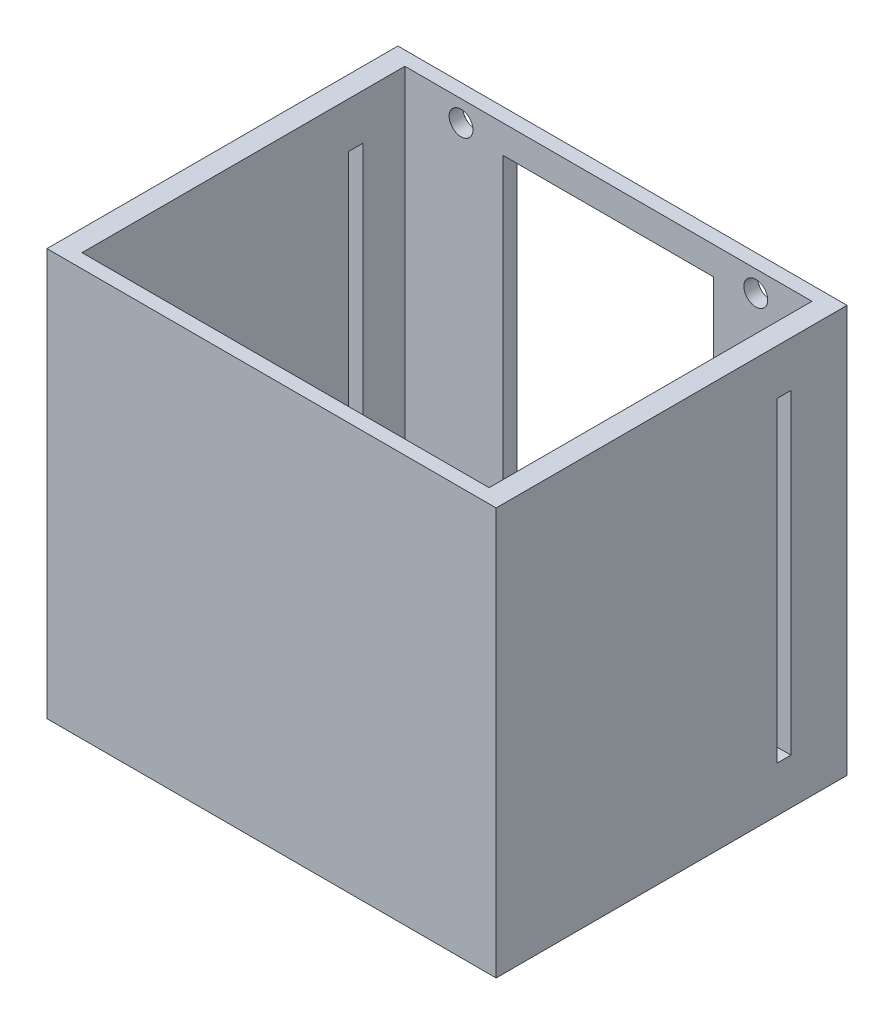
ISO-10303-21;
HEADER;
FILE_DESCRIPTION(('STEP AP214'),'2;1');
FILE_NAME('part.step','',(''),(''),'','','');
FILE_SCHEMA(('AUTOMOTIVE_DESIGN { 1 0 10303 214 1 1 1 1 }'));
ENDSEC;
DATA;
#1=APPLICATION_CONTEXT('core data for automotive mechanical design processes');
#2=APPLICATION_PROTOCOL_DEFINITION('international standard','automotive_design',2000,#1);
#3=PRODUCT_CONTEXT('',#1,'mechanical');
#4=PRODUCT('Part','Part','',(#3));
#5=PRODUCT_RELATED_PRODUCT_CATEGORY('part','',(#4));
#6=PRODUCT_DEFINITION_FORMATION('','',#4);
#7=PRODUCT_DEFINITION_CONTEXT('part definition',#1,'design');
#8=PRODUCT_DEFINITION('design','',#6,#7);
#9=PRODUCT_DEFINITION_SHAPE('','',#8);
#10=(LENGTH_UNIT() NAMED_UNIT(*) SI_UNIT(.MILLI.,.METRE.));
#11=(NAMED_UNIT(*) PLANE_ANGLE_UNIT() SI_UNIT($,.RADIAN.));
#12=(NAMED_UNIT(*) SI_UNIT($,.STERADIAN.) SOLID_ANGLE_UNIT());
#13=UNCERTAINTY_MEASURE_WITH_UNIT(LENGTH_MEASURE(1.E-05),#10,'distance_accuracy_value','');
#14=(GEOMETRIC_REPRESENTATION_CONTEXT(3) GLOBAL_UNCERTAINTY_ASSIGNED_CONTEXT((#13)) GLOBAL_UNIT_ASSIGNED_CONTEXT((#10,
#11,#12)) REPRESENTATION_CONTEXT('',''));
#15=CARTESIAN_POINT('',(0.,0.,0.));
#16=DIRECTION('',(0.,0.,1.));
#17=DIRECTION('',(1.,0.,0.));
#18=AXIS2_PLACEMENT_3D('',#15,#16,#17);
#19=CARTESIAN_POINT('',(-32.,58.,25.));
#20=DIRECTION('',(1.,0.,0.));
#21=DIRECTION('',(0.,0.,-1.));
#22=AXIS2_PLACEMENT_3D('',#19,#20,#21);
#23=PLANE('',#22);
#24=DIRECTION('',(0.,0.,-1.));
#25=VECTOR('',#24,1.);
#26=CARTESIAN_POINT('',(-32.,6.50000000000002,25.));
#27=LINE('',#26,#25);
#28=CARTESIAN_POINT('',(-32.,6.50000000000002,-15.));
#29=VERTEX_POINT('',#28);
#30=CARTESIAN_POINT('',(-32.,6.50000000000002,-17.));
#31=VERTEX_POINT('',#30);
#32=EDGE_CURVE('E255',#29,#31,#27,.T.);
#33=ORIENTED_EDGE('',*,*,#32,.T.);
#34=DIRECTION('',(0.,1.,0.));
#35=VECTOR('',#34,1.);
#36=CARTESIAN_POINT('',(-32.,58.,-17.));
#37=LINE('',#36,#35);
#38=CARTESIAN_POINT('',(-32.,51.5,-17.));
#39=VERTEX_POINT('',#38);
#40=EDGE_CURVE('E258',#31,#39,#37,.T.);
#41=ORIENTED_EDGE('',*,*,#40,.T.);
#42=DIRECTION('',(0.,0.,1.));
#43=VECTOR('',#42,1.);
#44=CARTESIAN_POINT('',(-32.,51.5,25.));
#45=LINE('',#44,#43);
#46=CARTESIAN_POINT('',(-32.,51.5,-15.));
#47=VERTEX_POINT('',#46);
#48=EDGE_CURVE('E243',#39,#47,#45,.T.);
#49=ORIENTED_EDGE('',*,*,#48,.T.);
#50=DIRECTION('',(0.,-1.,0.));
#51=VECTOR('',#50,1.);
#52=CARTESIAN_POINT('',(-32.,58.,-15.));
#53=LINE('',#52,#51);
#54=EDGE_CURVE('E252',#47,#29,#53,.T.);
#55=ORIENTED_EDGE('',*,*,#54,.T.);
#56=EDGE_LOOP('',(#33,#41,#49,#55));
#57=FACE_BOUND('',#56,.T.);
#58=DIRECTION('',(0.,0.,1.));
#59=VECTOR('',#58,1.);
#60=CARTESIAN_POINT('',(-32.,0.,25.));
#61=LINE('',#60,#59);
#62=CARTESIAN_POINT('',(-32.,0.,-25.));
#63=VERTEX_POINT('',#62);
#64=CARTESIAN_POINT('',(-32.,0.,25.));
#65=VERTEX_POINT('',#64);
#66=EDGE_CURVE('E319',#63,#65,#61,.T.);
#67=ORIENTED_EDGE('',*,*,#66,.T.);
#68=DIRECTION('',(0.,-1.,0.));
#69=VECTOR('',#68,1.);
#70=CARTESIAN_POINT('',(-32.,58.,25.));
#71=LINE('',#70,#69);
#72=CARTESIAN_POINT('',(-32.,58.,25.));
#73=VERTEX_POINT('',#72);
#74=EDGE_CURVE('E352',#73,#65,#71,.T.);
#75=ORIENTED_EDGE('',*,*,#74,.F.);
#76=DIRECTION('',(0.,0.,1.));
#77=VECTOR('',#76,1.);
#78=CARTESIAN_POINT('',(-32.,58.,25.));
#79=LINE('',#78,#77);
#80=CARTESIAN_POINT('',(-32.,58.,-25.));
#81=VERTEX_POINT('',#80);
#82=EDGE_CURVE('E326',#81,#73,#79,.T.);
#83=ORIENTED_EDGE('',*,*,#82,.F.);
#84=DIRECTION('',(0.,-1.,0.));
#85=VECTOR('',#84,1.);
#86=CARTESIAN_POINT('',(-32.,58.,-25.));
#87=LINE('',#86,#85);
#88=EDGE_CURVE('E336',#81,#63,#87,.T.);
#89=ORIENTED_EDGE('',*,*,#88,.T.);
#90=EDGE_LOOP('',(#67,#75,#83,#89));
#91=FACE_BOUND('',#90,.T.);
#92=ADVANCED_FACE('F37',(#57,#91),#23,.F.);
#93=CARTESIAN_POINT('',(32.,58.,25.));
#94=DIRECTION('',(0.,0.,-1.));
#95=DIRECTION('',(-1.,0.,0.));
#96=AXIS2_PLACEMENT_3D('',#93,#94,#95);
#97=PLANE('',#96);
#98=DIRECTION('',(1.,0.,0.));
#99=VECTOR('',#98,1.);
#100=CARTESIAN_POINT('',(32.,0.,25.));
#101=LINE('',#100,#99);
#102=CARTESIAN_POINT('',(32.,0.,25.));
#103=VERTEX_POINT('',#102);
#104=EDGE_CURVE('E339',#65,#103,#101,.T.);
#105=ORIENTED_EDGE('',*,*,#104,.T.);
#106=DIRECTION('',(0.,-1.,0.));
#107=VECTOR('',#106,1.);
#108=CARTESIAN_POINT('',(32.,58.,25.));
#109=LINE('',#108,#107);
#110=CARTESIAN_POINT('',(32.,58.,25.));
#111=VERTEX_POINT('',#110);
#112=EDGE_CURVE('E349',#111,#103,#109,.T.);
#113=ORIENTED_EDGE('',*,*,#112,.F.);
#114=DIRECTION('',(1.,0.,0.));
#115=VECTOR('',#114,1.);
#116=CARTESIAN_POINT('',(32.,58.,25.));
#117=LINE('',#116,#115);
#118=EDGE_CURVE('E329',#73,#111,#117,.T.);
#119=ORIENTED_EDGE('',*,*,#118,.F.);
#120=ORIENTED_EDGE('',*,*,#74,.T.);
#121=EDGE_LOOP('',(#105,#113,#119,#120));
#122=FACE_BOUND('',#121,.T.);
#123=ADVANCED_FACE('F386',(#122),#97,.F.);
#124=CARTESIAN_POINT('',(32.,58.,25.));
#125=DIRECTION('',(-1.,0.,0.));
#126=DIRECTION('',(0.,0.,1.));
#127=AXIS2_PLACEMENT_3D('',#124,#125,#126);
#128=PLANE('',#127);
#129=DIRECTION('',(0.,0.,-1.));
#130=VECTOR('',#129,1.);
#131=CARTESIAN_POINT('',(32.,51.5,25.));
#132=LINE('',#131,#130);
#133=CARTESIAN_POINT('',(32.,51.5,-15.));
#134=VERTEX_POINT('',#133);
#135=CARTESIAN_POINT('',(32.,51.5,-17.));
#136=VERTEX_POINT('',#135);
#137=EDGE_CURVE('E287',#134,#136,#132,.T.);
#138=ORIENTED_EDGE('',*,*,#137,.T.);
#139=DIRECTION('',(0.,-1.,0.));
#140=VECTOR('',#139,1.);
#141=CARTESIAN_POINT('',(32.,58.,-17.));
#142=LINE('',#141,#140);
#143=CARTESIAN_POINT('',(32.,6.5,-17.));
#144=VERTEX_POINT('',#143);
#145=EDGE_CURVE('E290',#136,#144,#142,.T.);
#146=ORIENTED_EDGE('',*,*,#145,.T.);
#147=DIRECTION('',(0.,0.,1.));
#148=VECTOR('',#147,1.);
#149=CARTESIAN_POINT('',(32.,6.5,25.));
#150=LINE('',#149,#148);
#151=CARTESIAN_POINT('',(32.,6.5,-15.));
#152=VERTEX_POINT('',#151);
#153=EDGE_CURVE('E275',#144,#152,#150,.T.);
#154=ORIENTED_EDGE('',*,*,#153,.T.);
#155=DIRECTION('',(0.,1.,0.));
#156=VECTOR('',#155,1.);
#157=CARTESIAN_POINT('',(32.,58.,-15.));
#158=LINE('',#157,#156);
#159=EDGE_CURVE('E284',#152,#134,#158,.T.);
#160=ORIENTED_EDGE('',*,*,#159,.T.);
#161=EDGE_LOOP('',(#138,#146,#154,#160));
#162=FACE_BOUND('',#161,.T.);
#163=DIRECTION('',(0.,0.,-1.));
#164=VECTOR('',#163,1.);
#165=CARTESIAN_POINT('',(32.,0.,25.));
#166=LINE('',#165,#164);
#167=CARTESIAN_POINT('',(32.,0.,-25.));
#168=VERTEX_POINT('',#167);
#169=EDGE_CURVE('E341',#103,#168,#166,.T.);
#170=ORIENTED_EDGE('',*,*,#169,.T.);
#171=DIRECTION('',(0.,-1.,0.));
#172=VECTOR('',#171,1.);
#173=CARTESIAN_POINT('',(32.,58.,-25.));
#174=LINE('',#173,#172);
#175=CARTESIAN_POINT('',(32.,58.,-25.));
#176=VERTEX_POINT('',#175);
#177=EDGE_CURVE('E346',#176,#168,#174,.T.);
#178=ORIENTED_EDGE('',*,*,#177,.F.);
#179=DIRECTION('',(0.,0.,-1.));
#180=VECTOR('',#179,1.);
#181=CARTESIAN_POINT('',(32.,58.,25.));
#182=LINE('',#181,#180);
#183=EDGE_CURVE('E332',#111,#176,#182,.T.);
#184=ORIENTED_EDGE('',*,*,#183,.F.);
#185=ORIENTED_EDGE('',*,*,#112,.T.);
#186=EDGE_LOOP('',(#170,#178,#184,#185));
#187=FACE_BOUND('',#186,.T.);
#188=ADVANCED_FACE('F391',(#162,#187),#128,.F.);
#189=CARTESIAN_POINT('',(32.,58.,-25.));
#190=DIRECTION('',(0.,0.,1.));
#191=DIRECTION('',(1.,0.,0.));
#192=AXIS2_PLACEMENT_3D('',#189,#190,#191);
#193=PLANE('',#192);
#194=DIRECTION('',(-1.,0.,0.));
#195=VECTOR('',#194,1.);
#196=CARTESIAN_POINT('',(-15.,4.,-25.));
#197=LINE('',#196,#195);
#198=CARTESIAN_POINT('',(15.,4.,-25.));
#199=VERTEX_POINT('',#198);
#200=CARTESIAN_POINT('',(-15.,4.,-25.));
#201=VERTEX_POINT('',#200);
#202=EDGE_CURVE('E185',#199,#201,#197,.T.);
#203=ORIENTED_EDGE('',*,*,#202,.F.);
#204=DIRECTION('',(0.,-1.,0.));
#205=VECTOR('',#204,1.);
#206=CARTESIAN_POINT('',(15.,4.,-25.));
#207=LINE('',#206,#205);
#208=CARTESIAN_POINT('',(15.,54.,-25.));
#209=VERTEX_POINT('',#208);
#210=EDGE_CURVE('E51',#209,#199,#207,.T.);
#211=ORIENTED_EDGE('',*,*,#210,.F.);
#212=DIRECTION('',(1.,0.,0.));
#213=VECTOR('',#212,1.);
#214=CARTESIAN_POINT('',(-15.,54.,-25.));
#215=LINE('',#214,#213);
#216=CARTESIAN_POINT('',(-15.,54.,-25.));
#217=VERTEX_POINT('',#216);
#218=EDGE_CURVE('E192',#217,#209,#215,.T.);
#219=ORIENTED_EDGE('',*,*,#218,.F.);
#220=DIRECTION('',(0.,1.,0.));
#221=VECTOR('',#220,1.);
#222=CARTESIAN_POINT('',(-15.,4.,-25.));
#223=LINE('',#222,#221);
#224=EDGE_CURVE('E176',#201,#217,#223,.T.);
#225=ORIENTED_EDGE('',*,*,#224,.F.);
#226=EDGE_LOOP('',(#203,#211,#219,#225));
#227=FACE_BOUND('',#226,.T.);
#228=CARTESIAN_POINT('',(21.,55.,-25.));
#229=DIRECTION('',(0.,0.,-1.));
#230=DIRECTION('',(-1.,0.,0.));
#231=AXIS2_PLACEMENT_3D('',#228,#229,#230);
#232=CIRCLE('',#231,1.725);
#233=CARTESIAN_POINT('',(19.275,55.,-25.));
#234=VERTEX_POINT('',#233);
#235=EDGE_CURVE('E199',#234,#234,#232,.T.);
#236=ORIENTED_EDGE('',*,*,#235,.F.);
#237=EDGE_LOOP('',(#236));
#238=FACE_BOUND('',#237,.T.);
#239=CARTESIAN_POINT('',(21.,3.,-25.));
#240=DIRECTION('',(0.,0.,-1.));
#241=DIRECTION('',(-1.,0.,0.));
#242=AXIS2_PLACEMENT_3D('',#239,#240,#241);
#243=CIRCLE('',#242,1.725);
#244=CARTESIAN_POINT('',(19.275,3.,-25.));
#245=VERTEX_POINT('',#244);
#246=EDGE_CURVE('E208',#245,#245,#243,.T.);
#247=ORIENTED_EDGE('',*,*,#246,.F.);
#248=EDGE_LOOP('',(#247));
#249=FACE_BOUND('',#248,.T.);
#250=CARTESIAN_POINT('',(-21.,3.,-25.));
#251=DIRECTION('',(0.,0.,-1.));
#252=DIRECTION('',(-1.,0.,0.));
#253=AXIS2_PLACEMENT_3D('',#250,#251,#252);
#254=CIRCLE('',#253,1.725);
#255=CARTESIAN_POINT('',(-22.725,3.,-25.));
#256=VERTEX_POINT('',#255);
#257=EDGE_CURVE('E215',#256,#256,#254,.T.);
#258=ORIENTED_EDGE('',*,*,#257,.F.);
#259=EDGE_LOOP('',(#258));
#260=FACE_BOUND('',#259,.T.);
#261=CARTESIAN_POINT('',(-21.,55.,-25.));
#262=DIRECTION('',(0.,0.,-1.));
#263=DIRECTION('',(-1.,0.,0.));
#264=AXIS2_PLACEMENT_3D('',#261,#262,#263);
#265=CIRCLE('',#264,1.725);
#266=CARTESIAN_POINT('',(-22.725,55.,-25.));
#267=VERTEX_POINT('',#266);
#268=EDGE_CURVE('E222',#267,#267,#265,.T.);
#269=ORIENTED_EDGE('',*,*,#268,.F.);
#270=EDGE_LOOP('',(#269));
#271=FACE_BOUND('',#270,.T.);
#272=DIRECTION('',(-1.,0.,0.));
#273=VECTOR('',#272,1.);
#274=CARTESIAN_POINT('',(32.,0.,-25.));
#275=LINE('',#274,#273);
#276=EDGE_CURVE('E330',#168,#63,#275,.T.);
#277=ORIENTED_EDGE('',*,*,#276,.T.);
#278=ORIENTED_EDGE('',*,*,#88,.F.);
#279=DIRECTION('',(-1.,0.,0.));
#280=VECTOR('',#279,1.);
#281=CARTESIAN_POINT('',(32.,58.,-25.));
#282=LINE('',#281,#280);
#283=EDGE_CURVE('E334',#176,#81,#282,.T.);
#284=ORIENTED_EDGE('',*,*,#283,.F.);
#285=ORIENTED_EDGE('',*,*,#177,.T.);
#286=EDGE_LOOP('',(#277,#278,#284,#285));
#287=FACE_BOUND('',#286,.T.);
#288=ADVANCED_FACE('F189',(#227,#238,#249,#260,#271,#287),#193,.F.);
#289=CARTESIAN_POINT('',(0.,58.,0.));
#290=DIRECTION('',(0.,1.,0.));
#291=DIRECTION('',(0.,0.,1.));
#292=AXIS2_PLACEMENT_3D('',#289,#290,#291);
#293=PLANE('',#292);
#294=DIRECTION('',(0.,0.,-1.));
#295=VECTOR('',#294,1.);
#296=CARTESIAN_POINT('',(-29.,58.,-23.));
#297=LINE('',#296,#295);
#298=CARTESIAN_POINT('',(-29.,58.,23.));
#299=VERTEX_POINT('',#298);
#300=CARTESIAN_POINT('',(-29.,58.,-23.));
#301=VERTEX_POINT('',#300);
#302=EDGE_CURVE('E294',#299,#301,#297,.T.);
#303=ORIENTED_EDGE('',*,*,#302,.T.);
#304=DIRECTION('',(1.,0.,0.));
#305=VECTOR('',#304,1.);
#306=CARTESIAN_POINT('',(29.,58.,-23.));
#307=LINE('',#306,#305);
#308=CARTESIAN_POINT('',(29.,58.,-23.));
#309=VERTEX_POINT('',#308);
#310=EDGE_CURVE('E297',#301,#309,#307,.T.);
#311=ORIENTED_EDGE('',*,*,#310,.T.);
#312=DIRECTION('',(0.,0.,1.));
#313=VECTOR('',#312,1.);
#314=CARTESIAN_POINT('',(29.,58.,-23.));
#315=LINE('',#314,#313);
#316=CARTESIAN_POINT('',(29.,58.,23.));
#317=VERTEX_POINT('',#316);
#318=EDGE_CURVE('E301',#309,#317,#315,.T.);
#319=ORIENTED_EDGE('',*,*,#318,.T.);
#320=DIRECTION('',(-1.,0.,0.));
#321=VECTOR('',#320,1.);
#322=CARTESIAN_POINT('',(29.,58.,23.));
#323=LINE('',#322,#321);
#324=EDGE_CURVE('E304',#317,#299,#323,.T.);
#325=ORIENTED_EDGE('',*,*,#324,.T.);
#326=EDGE_LOOP('',(#303,#311,#319,#325));
#327=FACE_BOUND('',#326,.T.);
#328=ORIENTED_EDGE('',*,*,#82,.T.);
#329=ORIENTED_EDGE('',*,*,#118,.T.);
#330=ORIENTED_EDGE('',*,*,#183,.T.);
#331=ORIENTED_EDGE('',*,*,#283,.T.);
#332=EDGE_LOOP('',(#328,#329,#330,#331));
#333=FACE_BOUND('',#332,.T.);
#334=ADVANCED_FACE('F405',(#327,#333),#293,.T.);
#335=CARTESIAN_POINT('',(0.,0.,0.));
#336=DIRECTION('',(0.,1.,0.));
#337=DIRECTION('',(0.,0.,1.));
#338=AXIS2_PLACEMENT_3D('',#335,#336,#337);
#339=PLANE('',#338);
#340=DIRECTION('',(1.,0.,0.));
#341=VECTOR('',#340,1.);
#342=CARTESIAN_POINT('',(29.,0.,-23.));
#343=LINE('',#342,#341);
#344=CARTESIAN_POINT('',(-29.,0.,-23.));
#345=VERTEX_POINT('',#344);
#346=CARTESIAN_POINT('',(29.,0.,-23.));
#347=VERTEX_POINT('',#346);
#348=EDGE_CURVE('E309',#345,#347,#343,.T.);
#349=ORIENTED_EDGE('',*,*,#348,.F.);
#350=DIRECTION('',(0.,0.,-1.));
#351=VECTOR('',#350,1.);
#352=CARTESIAN_POINT('',(-29.,0.,-23.));
#353=LINE('',#352,#351);
#354=CARTESIAN_POINT('',(-29.,0.,23.));
#355=VERTEX_POINT('',#354);
#356=EDGE_CURVE('E293',#355,#345,#353,.T.);
#357=ORIENTED_EDGE('',*,*,#356,.F.);
#358=DIRECTION('',(-1.,0.,0.));
#359=VECTOR('',#358,1.);
#360=CARTESIAN_POINT('',(29.,0.,23.));
#361=LINE('',#360,#359);
#362=CARTESIAN_POINT('',(29.,0.,23.));
#363=VERTEX_POINT('',#362);
#364=EDGE_CURVE('E298',#363,#355,#361,.T.);
#365=ORIENTED_EDGE('',*,*,#364,.F.);
#366=DIRECTION('',(0.,0.,1.));
#367=VECTOR('',#366,1.);
#368=CARTESIAN_POINT('',(29.,0.,-23.));
#369=LINE('',#368,#367);
#370=EDGE_CURVE('E312',#347,#363,#369,.T.);
#371=ORIENTED_EDGE('',*,*,#370,.F.);
#372=EDGE_LOOP('',(#349,#357,#365,#371));
#373=FACE_BOUND('',#372,.T.);
#374=ORIENTED_EDGE('',*,*,#66,.F.);
#375=ORIENTED_EDGE('',*,*,#276,.F.);
#376=ORIENTED_EDGE('',*,*,#169,.F.);
#377=ORIENTED_EDGE('',*,*,#104,.F.);
#378=EDGE_LOOP('',(#374,#375,#376,#377));
#379=FACE_BOUND('',#378,.T.);
#380=ADVANCED_FACE('F400',(#373,#379),#339,.F.);
#381=CARTESIAN_POINT('',(-29.,58.,-23.));
#382=DIRECTION('',(-1.,0.,0.));
#383=DIRECTION('',(0.,0.,1.));
#384=AXIS2_PLACEMENT_3D('',#381,#382,#383);
#385=PLANE('',#384);
#386=DIRECTION('',(0.,0.,1.));
#387=VECTOR('',#386,1.);
#388=CARTESIAN_POINT('',(-29.,51.5,-15.));
#389=LINE('',#388,#387);
#390=CARTESIAN_POINT('',(-29.,51.5,-17.));
#391=VERTEX_POINT('',#390);
#392=CARTESIAN_POINT('',(-29.,51.5,-15.));
#393=VERTEX_POINT('',#392);
#394=EDGE_CURVE('E231',#391,#393,#389,.T.);
#395=ORIENTED_EDGE('',*,*,#394,.F.);
#396=DIRECTION('',(0.,1.,0.));
#397=VECTOR('',#396,1.);
#398=CARTESIAN_POINT('',(-29.,51.5,-17.));
#399=LINE('',#398,#397);
#400=CARTESIAN_POINT('',(-29.,6.50000000000002,-17.));
#401=VERTEX_POINT('',#400);
#402=EDGE_CURVE('E229',#401,#391,#399,.T.);
#403=ORIENTED_EDGE('',*,*,#402,.F.);
#404=DIRECTION('',(0.,0.,-1.));
#405=VECTOR('',#404,1.);
#406=CARTESIAN_POINT('',(-29.,6.50000000000002,-15.));
#407=LINE('',#406,#405);
#408=CARTESIAN_POINT('',(-29.,6.50000000000002,-15.));
#409=VERTEX_POINT('',#408);
#410=EDGE_CURVE('E237',#409,#401,#407,.T.);
#411=ORIENTED_EDGE('',*,*,#410,.F.);
#412=DIRECTION('',(0.,-1.,0.));
#413=VECTOR('',#412,1.);
#414=CARTESIAN_POINT('',(-29.,51.5,-15.));
#415=LINE('',#414,#413);
#416=EDGE_CURVE('E234',#393,#409,#415,.T.);
#417=ORIENTED_EDGE('',*,*,#416,.F.);
#418=EDGE_LOOP('',(#395,#403,#411,#417));
#419=FACE_BOUND('',#418,.T.);
#420=ORIENTED_EDGE('',*,*,#356,.T.);
#421=DIRECTION('',(0.,-1.,0.));
#422=VECTOR('',#421,1.);
#423=CARTESIAN_POINT('',(-29.,58.,-23.));
#424=LINE('',#423,#422);
#425=EDGE_CURVE('E307',#301,#345,#424,.T.);
#426=ORIENTED_EDGE('',*,*,#425,.F.);
#427=ORIENTED_EDGE('',*,*,#302,.F.);
#428=DIRECTION('',(0.,-1.,0.));
#429=VECTOR('',#428,1.);
#430=CARTESIAN_POINT('',(-29.,58.,23.));
#431=LINE('',#430,#429);
#432=EDGE_CURVE('E317',#299,#355,#431,.T.);
#433=ORIENTED_EDGE('',*,*,#432,.T.);
#434=EDGE_LOOP('',(#420,#426,#427,#433));
#435=FACE_BOUND('',#434,.T.);
#436=ADVANCED_FACE('F420',(#419,#435),#385,.F.);
#437=CARTESIAN_POINT('',(29.,58.,23.));
#438=DIRECTION('',(0.,0.,1.));
#439=DIRECTION('',(1.,0.,0.));
#440=AXIS2_PLACEMENT_3D('',#437,#438,#439);
#441=PLANE('',#440);
#442=ORIENTED_EDGE('',*,*,#364,.T.);
#443=ORIENTED_EDGE('',*,*,#432,.F.);
#444=ORIENTED_EDGE('',*,*,#324,.F.);
#445=DIRECTION('',(0.,-1.,0.));
#446=VECTOR('',#445,1.);
#447=CARTESIAN_POINT('',(29.,58.,23.));
#448=LINE('',#447,#446);
#449=EDGE_CURVE('E320',#317,#363,#448,.T.);
#450=ORIENTED_EDGE('',*,*,#449,.T.);
#451=EDGE_LOOP('',(#442,#443,#444,#450));
#452=FACE_BOUND('',#451,.T.);
#453=ADVANCED_FACE('F427',(#452),#441,.F.);
#454=CARTESIAN_POINT('',(29.,58.,-23.));
#455=DIRECTION('',(1.,0.,0.));
#456=DIRECTION('',(0.,0.,-1.));
#457=AXIS2_PLACEMENT_3D('',#454,#455,#456);
#458=PLANE('',#457);
#459=DIRECTION('',(0.,0.,1.));
#460=VECTOR('',#459,1.);
#461=CARTESIAN_POINT('',(29.,6.5,-15.));
#462=LINE('',#461,#460);
#463=CARTESIAN_POINT('',(29.,6.5,-17.));
#464=VERTEX_POINT('',#463);
#465=CARTESIAN_POINT('',(29.,6.5,-15.));
#466=VERTEX_POINT('',#465);
#467=EDGE_CURVE('E263',#464,#466,#462,.T.);
#468=ORIENTED_EDGE('',*,*,#467,.F.);
#469=DIRECTION('',(0.,-1.,0.));
#470=VECTOR('',#469,1.);
#471=CARTESIAN_POINT('',(29.,6.5,-17.));
#472=LINE('',#471,#470);
#473=CARTESIAN_POINT('',(29.,51.5,-17.));
#474=VERTEX_POINT('',#473);
#475=EDGE_CURVE('E261',#474,#464,#472,.T.);
#476=ORIENTED_EDGE('',*,*,#475,.F.);
#477=DIRECTION('',(0.,0.,-1.));
#478=VECTOR('',#477,1.);
#479=CARTESIAN_POINT('',(29.,51.5,-15.));
#480=LINE('',#479,#478);
#481=CARTESIAN_POINT('',(29.,51.5,-15.));
#482=VERTEX_POINT('',#481);
#483=EDGE_CURVE('E269',#482,#474,#480,.T.);
#484=ORIENTED_EDGE('',*,*,#483,.F.);
#485=DIRECTION('',(0.,1.,0.));
#486=VECTOR('',#485,1.);
#487=CARTESIAN_POINT('',(29.,6.5,-15.));
#488=LINE('',#487,#486);
#489=EDGE_CURVE('E266',#466,#482,#488,.T.);
#490=ORIENTED_EDGE('',*,*,#489,.F.);
#491=EDGE_LOOP('',(#468,#476,#484,#490));
#492=FACE_BOUND('',#491,.T.);
#493=ORIENTED_EDGE('',*,*,#370,.T.);
#494=ORIENTED_EDGE('',*,*,#449,.F.);
#495=ORIENTED_EDGE('',*,*,#318,.F.);
#496=DIRECTION('',(0.,-1.,0.));
#497=VECTOR('',#496,1.);
#498=CARTESIAN_POINT('',(29.,58.,-23.));
#499=LINE('',#498,#497);
#500=EDGE_CURVE('E322',#309,#347,#499,.T.);
#501=ORIENTED_EDGE('',*,*,#500,.T.);
#502=EDGE_LOOP('',(#493,#494,#495,#501));
#503=FACE_BOUND('',#502,.T.);
#504=ADVANCED_FACE('F432',(#492,#503),#458,.F.);
#505=CARTESIAN_POINT('',(29.,58.,-23.));
#506=DIRECTION('',(0.,0.,-1.));
#507=DIRECTION('',(-1.,0.,0.));
#508=AXIS2_PLACEMENT_3D('',#505,#506,#507);
#509=PLANE('',#508);
#510=DIRECTION('',(1.,0.,0.));
#511=VECTOR('',#510,1.);
#512=CARTESIAN_POINT('',(29.,54.,-23.));
#513=LINE('',#512,#511);
#514=CARTESIAN_POINT('',(-15.,54.,-23.));
#515=VERTEX_POINT('',#514);
#516=CARTESIAN_POINT('',(15.,54.,-23.));
#517=VERTEX_POINT('',#516);
#518=EDGE_CURVE('E44',#515,#517,#513,.T.);
#519=ORIENTED_EDGE('',*,*,#518,.T.);
#520=DIRECTION('',(0.,-1.,0.));
#521=VECTOR('',#520,1.);
#522=CARTESIAN_POINT('',(15.,58.,-23.));
#523=LINE('',#522,#521);
#524=CARTESIAN_POINT('',(15.,4.,-23.));
#525=VERTEX_POINT('',#524);
#526=EDGE_CURVE('E11',#517,#525,#523,.T.);
#527=ORIENTED_EDGE('',*,*,#526,.T.);
#528=DIRECTION('',(-1.,0.,0.));
#529=VECTOR('',#528,1.);
#530=CARTESIAN_POINT('',(29.,4.,-23.));
#531=LINE('',#530,#529);
#532=CARTESIAN_POINT('',(-15.,4.,-23.));
#533=VERTEX_POINT('',#532);
#534=EDGE_CURVE('E355',#525,#533,#531,.T.);
#535=ORIENTED_EDGE('',*,*,#534,.T.);
#536=DIRECTION('',(0.,1.,0.));
#537=VECTOR('',#536,1.);
#538=CARTESIAN_POINT('',(-15.,58.,-23.));
#539=LINE('',#538,#537);
#540=EDGE_CURVE('E179',#533,#515,#539,.T.);
#541=ORIENTED_EDGE('',*,*,#540,.T.);
#542=EDGE_LOOP('',(#519,#527,#535,#541));
#543=FACE_BOUND('',#542,.T.);
#544=CARTESIAN_POINT('',(21.,55.,-23.));
#545=DIRECTION('',(0.,0.,-1.));
#546=DIRECTION('',(-1.,0.,0.));
#547=AXIS2_PLACEMENT_3D('',#544,#545,#546);
#548=CIRCLE('',#547,1.69999999999999);
#549=CARTESIAN_POINT('',(19.3,55.,-23.));
#550=VERTEX_POINT('',#549);
#551=EDGE_CURVE('E207',#550,#550,#548,.T.);
#552=ORIENTED_EDGE('',*,*,#551,.T.);
#553=EDGE_LOOP('',(#552));
#554=FACE_BOUND('',#553,.T.);
#555=CARTESIAN_POINT('',(21.,3.,-23.));
#556=DIRECTION('',(0.,0.,-1.));
#557=DIRECTION('',(-1.,0.,0.));
#558=AXIS2_PLACEMENT_3D('',#555,#556,#557);
#559=CIRCLE('',#558,1.69999999999999);
#560=CARTESIAN_POINT('',(19.3,3.,-23.));
#561=VERTEX_POINT('',#560);
#562=EDGE_CURVE('E214',#561,#561,#559,.T.);
#563=ORIENTED_EDGE('',*,*,#562,.T.);
#564=EDGE_LOOP('',(#563));
#565=FACE_BOUND('',#564,.T.);
#566=CARTESIAN_POINT('',(-21.,3.,-23.));
#567=DIRECTION('',(0.,0.,-1.));
#568=DIRECTION('',(-1.,0.,0.));
#569=AXIS2_PLACEMENT_3D('',#566,#567,#568);
#570=CIRCLE('',#569,1.69999999999999);
#571=CARTESIAN_POINT('',(-22.7,3.,-23.));
#572=VERTEX_POINT('',#571);
#573=EDGE_CURVE('E221',#572,#572,#570,.T.);
#574=ORIENTED_EDGE('',*,*,#573,.T.);
#575=EDGE_LOOP('',(#574));
#576=FACE_BOUND('',#575,.T.);
#577=CARTESIAN_POINT('',(-21.,55.,-23.));
#578=DIRECTION('',(0.,0.,-1.));
#579=DIRECTION('',(-1.,0.,0.));
#580=AXIS2_PLACEMENT_3D('',#577,#578,#579);
#581=CIRCLE('',#580,1.69999999999999);
#582=CARTESIAN_POINT('',(-22.7,55.,-23.));
#583=VERTEX_POINT('',#582);
#584=EDGE_CURVE('E228',#583,#583,#581,.T.);
#585=ORIENTED_EDGE('',*,*,#584,.T.);
#586=EDGE_LOOP('',(#585));
#587=FACE_BOUND('',#586,.T.);
#588=ORIENTED_EDGE('',*,*,#348,.T.);
#589=ORIENTED_EDGE('',*,*,#500,.F.);
#590=ORIENTED_EDGE('',*,*,#310,.F.);
#591=ORIENTED_EDGE('',*,*,#425,.T.);
#592=EDGE_LOOP('',(#588,#589,#590,#591));
#593=FACE_BOUND('',#592,.T.);
#594=ADVANCED_FACE('F367',(#543,#554,#565,#576,#587,#593),#509,.F.);
#595=CARTESIAN_POINT('',(79.,6.5,-17.));
#596=DIRECTION('',(0.,0.,-1.));
#597=DIRECTION('',(-1.,0.,0.));
#598=AXIS2_PLACEMENT_3D('',#595,#596,#597);
#599=PLANE('',#598);
#600=DIRECTION('',(-1.,0.,0.));
#601=VECTOR('',#600,1.);
#602=CARTESIAN_POINT('',(79.,51.5,-17.));
#603=LINE('',#602,#601);
#604=EDGE_CURVE('E273',#136,#474,#603,.T.);
#605=ORIENTED_EDGE('',*,*,#604,.T.);
#606=ORIENTED_EDGE('',*,*,#475,.T.);
#607=DIRECTION('',(-1.,0.,0.));
#608=VECTOR('',#607,1.);
#609=CARTESIAN_POINT('',(79.,6.5,-17.));
#610=LINE('',#609,#608);
#611=EDGE_CURVE('E272',#144,#464,#610,.T.);
#612=ORIENTED_EDGE('',*,*,#611,.F.);
#613=ORIENTED_EDGE('',*,*,#145,.F.);
#614=EDGE_LOOP('',(#605,#606,#612,#613));
#615=FACE_BOUND('',#614,.T.);
#616=ADVANCED_FACE('F431',(#615),#599,.F.);
#617=CARTESIAN_POINT('',(79.,51.5,-15.));
#618=DIRECTION('',(0.,1.,0.));
#619=DIRECTION('',(0.,0.,1.));
#620=AXIS2_PLACEMENT_3D('',#617,#618,#619);
#621=PLANE('',#620);
#622=DIRECTION('',(-1.,0.,0.));
#623=VECTOR('',#622,1.);
#624=CARTESIAN_POINT('',(79.,51.5,-15.));
#625=LINE('',#624,#623);
#626=EDGE_CURVE('E276',#134,#482,#625,.T.);
#627=ORIENTED_EDGE('',*,*,#626,.T.);
#628=ORIENTED_EDGE('',*,*,#483,.T.);
#629=ORIENTED_EDGE('',*,*,#604,.F.);
#630=ORIENTED_EDGE('',*,*,#137,.F.);
#631=EDGE_LOOP('',(#627,#628,#629,#630));
#632=FACE_BOUND('',#631,.T.);
#633=ADVANCED_FACE('F441',(#632),#621,.F.);
#634=CARTESIAN_POINT('',(79.,6.5,-15.));
#635=DIRECTION('',(0.,0.,1.));
#636=DIRECTION('',(0.,-1.,0.));
#637=AXIS2_PLACEMENT_3D('',#634,#635,#636);
#638=PLANE('',#637);
#639=DIRECTION('',(-1.,0.,0.));
#640=VECTOR('',#639,1.);
#641=CARTESIAN_POINT('',(79.,6.5,-15.));
#642=LINE('',#641,#640);
#643=EDGE_CURVE('E278',#152,#466,#642,.T.);
#644=ORIENTED_EDGE('',*,*,#643,.T.);
#645=ORIENTED_EDGE('',*,*,#489,.T.);
#646=ORIENTED_EDGE('',*,*,#626,.F.);
#647=ORIENTED_EDGE('',*,*,#159,.F.);
#648=EDGE_LOOP('',(#644,#645,#646,#647));
#649=FACE_BOUND('',#648,.T.);
#650=ADVANCED_FACE('F447',(#649),#638,.F.);
#651=CARTESIAN_POINT('',(79.,6.5,-15.));
#652=DIRECTION('',(0.,-1.,0.));
#653=DIRECTION('',(0.,0.,-1.));
#654=AXIS2_PLACEMENT_3D('',#651,#652,#653);
#655=PLANE('',#654);
#656=ORIENTED_EDGE('',*,*,#611,.T.);
#657=ORIENTED_EDGE('',*,*,#467,.T.);
#658=ORIENTED_EDGE('',*,*,#643,.F.);
#659=ORIENTED_EDGE('',*,*,#153,.F.);
#660=EDGE_LOOP('',(#656,#657,#658,#659));
#661=FACE_BOUND('',#660,.T.);
#662=ADVANCED_FACE('F443',(#661),#655,.F.);
#663=CARTESIAN_POINT('',(-79.,51.5,-17.));
#664=DIRECTION('',(0.,0.,-1.));
#665=DIRECTION('',(0.,1.,0.));
#666=AXIS2_PLACEMENT_3D('',#663,#664,#665);
#667=PLANE('',#666);
#668=DIRECTION('',(1.,0.,0.));
#669=VECTOR('',#668,1.);
#670=CARTESIAN_POINT('',(-79.,6.50000000000002,-17.));
#671=LINE('',#670,#669);
#672=EDGE_CURVE('E241',#31,#401,#671,.T.);
#673=ORIENTED_EDGE('',*,*,#672,.T.);
#674=ORIENTED_EDGE('',*,*,#402,.T.);
#675=DIRECTION('',(1.,0.,0.));
#676=VECTOR('',#675,1.);
#677=CARTESIAN_POINT('',(-79.,51.5,-17.));
#678=LINE('',#677,#676);
#679=EDGE_CURVE('E240',#39,#391,#678,.T.);
#680=ORIENTED_EDGE('',*,*,#679,.F.);
#681=ORIENTED_EDGE('',*,*,#40,.F.);
#682=EDGE_LOOP('',(#673,#674,#680,#681));
#683=FACE_BOUND('',#682,.T.);
#684=ADVANCED_FACE('F446',(#683),#667,.F.);
#685=CARTESIAN_POINT('',(-79.,6.50000000000002,-15.));
#686=DIRECTION('',(0.,-1.,0.));
#687=DIRECTION('',(0.,0.,-1.));
#688=AXIS2_PLACEMENT_3D('',#685,#686,#687);
#689=PLANE('',#688);
#690=DIRECTION('',(1.,0.,0.));
#691=VECTOR('',#690,1.);
#692=CARTESIAN_POINT('',(-79.,6.50000000000002,-15.));
#693=LINE('',#692,#691);
#694=EDGE_CURVE('E244',#29,#409,#693,.T.);
#695=ORIENTED_EDGE('',*,*,#694,.T.);
#696=ORIENTED_EDGE('',*,*,#410,.T.);
#697=ORIENTED_EDGE('',*,*,#672,.F.);
#698=ORIENTED_EDGE('',*,*,#32,.F.);
#699=EDGE_LOOP('',(#695,#696,#697,#698));
#700=FACE_BOUND('',#699,.T.);
#701=ADVANCED_FACE('F457',(#700),#689,.F.);
#702=CARTESIAN_POINT('',(-79.,51.5,-15.));
#703=DIRECTION('',(0.,0.,1.));
#704=DIRECTION('',(0.,-1.,0.));
#705=AXIS2_PLACEMENT_3D('',#702,#703,#704);
#706=PLANE('',#705);
#707=DIRECTION('',(1.,0.,0.));
#708=VECTOR('',#707,1.);
#709=CARTESIAN_POINT('',(-79.,51.5,-15.));
#710=LINE('',#709,#708);
#711=EDGE_CURVE('E246',#47,#393,#710,.T.);
#712=ORIENTED_EDGE('',*,*,#711,.T.);
#713=ORIENTED_EDGE('',*,*,#416,.T.);
#714=ORIENTED_EDGE('',*,*,#694,.F.);
#715=ORIENTED_EDGE('',*,*,#54,.F.);
#716=EDGE_LOOP('',(#712,#713,#714,#715));
#717=FACE_BOUND('',#716,.T.);
#718=ADVANCED_FACE('F463',(#717),#706,.F.);
#719=CARTESIAN_POINT('',(-79.,51.5,-15.));
#720=DIRECTION('',(0.,1.,0.));
#721=DIRECTION('',(0.,0.,1.));
#722=AXIS2_PLACEMENT_3D('',#719,#720,#721);
#723=PLANE('',#722);
#724=ORIENTED_EDGE('',*,*,#679,.T.);
#725=ORIENTED_EDGE('',*,*,#394,.T.);
#726=ORIENTED_EDGE('',*,*,#711,.F.);
#727=ORIENTED_EDGE('',*,*,#48,.F.);
#728=EDGE_LOOP('',(#724,#725,#726,#727));
#729=FACE_BOUND('',#728,.T.);
#730=ADVANCED_FACE('F459',(#729),#723,.F.);
#731=CARTESIAN_POINT('',(-21.,55.,-25.));
#732=DIRECTION('',(0.,0.,-1.));
#733=DIRECTION('',(-1.,0.,0.));
#734=AXIS2_PLACEMENT_3D('',#731,#732,#733);
#735=CYLINDRICAL_SURFACE('',#734,1.69999999999999);
#736=CARTESIAN_POINT('',(-21.,55.,-24.975));
#737=DIRECTION('',(0.,0.,-1.));
#738=DIRECTION('',(-1.,0.,0.));
#739=AXIS2_PLACEMENT_3D('',#736,#737,#738);
#740=CIRCLE('',#739,1.7);
#741=CARTESIAN_POINT('',(-22.7,55.,-24.975));
#742=VERTEX_POINT('',#741);
#743=EDGE_CURVE('E225',#742,#742,#740,.T.);
#744=ORIENTED_EDGE('',*,*,#743,.T.);
#745=EDGE_LOOP('',(#744));
#746=FACE_BOUND('',#745,.T.);
#747=ORIENTED_EDGE('',*,*,#584,.F.);
#748=EDGE_LOOP('',(#747));
#749=FACE_BOUND('',#748,.T.);
#750=ADVANCED_FACE('F462',(#746,#749),#735,.F.);
#751=CARTESIAN_POINT('',(-21.,55.,-25.));
#752=DIRECTION('',(0.,0.,-1.));
#753=DIRECTION('',(-1.,0.,0.));
#754=AXIS2_PLACEMENT_3D('',#751,#752,#753);
#755=CONICAL_SURFACE('',#754,1.725,0.785398163397379);
#756=ORIENTED_EDGE('',*,*,#743,.F.);
#757=EDGE_LOOP('',(#756));
#758=FACE_BOUND('',#757,.T.);
#759=ORIENTED_EDGE('',*,*,#268,.T.);
#760=EDGE_LOOP('',(#759));
#761=FACE_BOUND('',#760,.T.);
#762=ADVANCED_FACE('F473',(#758,#761),#755,.F.);
#763=CARTESIAN_POINT('',(-21.,3.,-25.));
#764=DIRECTION('',(0.,0.,-1.));
#765=DIRECTION('',(-1.,0.,0.));
#766=AXIS2_PLACEMENT_3D('',#763,#764,#765);
#767=CYLINDRICAL_SURFACE('',#766,1.69999999999999);
#768=CARTESIAN_POINT('',(-21.,3.,-24.975));
#769=DIRECTION('',(0.,0.,-1.));
#770=DIRECTION('',(-1.,0.,0.));
#771=AXIS2_PLACEMENT_3D('',#768,#769,#770);
#772=CIRCLE('',#771,1.7);
#773=CARTESIAN_POINT('',(-22.7,3.,-24.975));
#774=VERTEX_POINT('',#773);
#775=EDGE_CURVE('E218',#774,#774,#772,.T.);
#776=ORIENTED_EDGE('',*,*,#775,.T.);
#777=EDGE_LOOP('',(#776));
#778=FACE_BOUND('',#777,.T.);
#779=ORIENTED_EDGE('',*,*,#573,.F.);
#780=EDGE_LOOP('',(#779));
#781=FACE_BOUND('',#780,.T.);
#782=ADVANCED_FACE('F477',(#778,#781),#767,.F.);
#783=CARTESIAN_POINT('',(-21.,3.,-25.));
#784=DIRECTION('',(0.,0.,-1.));
#785=DIRECTION('',(-1.,0.,0.));
#786=AXIS2_PLACEMENT_3D('',#783,#784,#785);
#787=CONICAL_SURFACE('',#786,1.725,0.785398163397379);
#788=ORIENTED_EDGE('',*,*,#775,.F.);
#789=EDGE_LOOP('',(#788));
#790=FACE_BOUND('',#789,.T.);
#791=ORIENTED_EDGE('',*,*,#257,.T.);
#792=EDGE_LOOP('',(#791));
#793=FACE_BOUND('',#792,.T.);
#794=ADVANCED_FACE('F481',(#790,#793),#787,.F.);
#795=CARTESIAN_POINT('',(21.,3.,-25.));
#796=DIRECTION('',(0.,0.,-1.));
#797=DIRECTION('',(-1.,0.,0.));
#798=AXIS2_PLACEMENT_3D('',#795,#796,#797);
#799=CYLINDRICAL_SURFACE('',#798,1.69999999999999);
#800=CARTESIAN_POINT('',(21.,3.,-24.975));
#801=DIRECTION('',(0.,0.,-1.));
#802=DIRECTION('',(-1.,0.,0.));
#803=AXIS2_PLACEMENT_3D('',#800,#801,#802);
#804=CIRCLE('',#803,1.7);
#805=CARTESIAN_POINT('',(19.3,3.,-24.975));
#806=VERTEX_POINT('',#805);
#807=EDGE_CURVE('E211',#806,#806,#804,.T.);
#808=ORIENTED_EDGE('',*,*,#807,.T.);
#809=EDGE_LOOP('',(#808));
#810=FACE_BOUND('',#809,.T.);
#811=ORIENTED_EDGE('',*,*,#562,.F.);
#812=EDGE_LOOP('',(#811));
#813=FACE_BOUND('',#812,.T.);
#814=ADVANCED_FACE('F485',(#810,#813),#799,.F.);
#815=CARTESIAN_POINT('',(21.,3.,-25.));
#816=DIRECTION('',(0.,0.,-1.));
#817=DIRECTION('',(-1.,0.,0.));
#818=AXIS2_PLACEMENT_3D('',#815,#816,#817);
#819=CONICAL_SURFACE('',#818,1.725,0.785398163397379);
#820=ORIENTED_EDGE('',*,*,#807,.F.);
#821=EDGE_LOOP('',(#820));
#822=FACE_BOUND('',#821,.T.);
#823=ORIENTED_EDGE('',*,*,#246,.T.);
#824=EDGE_LOOP('',(#823));
#825=FACE_BOUND('',#824,.T.);
#826=ADVANCED_FACE('F489',(#822,#825),#819,.F.);
#827=CARTESIAN_POINT('',(21.,55.,-25.));
#828=DIRECTION('',(0.,0.,-1.));
#829=DIRECTION('',(-1.,0.,0.));
#830=AXIS2_PLACEMENT_3D('',#827,#828,#829);
#831=CYLINDRICAL_SURFACE('',#830,1.69999999999999);
#832=CARTESIAN_POINT('',(21.,55.,-24.975));
#833=DIRECTION('',(0.,0.,-1.));
#834=DIRECTION('',(-1.,0.,0.));
#835=AXIS2_PLACEMENT_3D('',#832,#833,#834);
#836=CIRCLE('',#835,1.7);
#837=CARTESIAN_POINT('',(19.3,55.,-24.975));
#838=VERTEX_POINT('',#837);
#839=EDGE_CURVE('E204',#838,#838,#836,.T.);
#840=ORIENTED_EDGE('',*,*,#839,.T.);
#841=EDGE_LOOP('',(#840));
#842=FACE_BOUND('',#841,.T.);
#843=ORIENTED_EDGE('',*,*,#551,.F.);
#844=EDGE_LOOP('',(#843));
#845=FACE_BOUND('',#844,.T.);
#846=ADVANCED_FACE('F381',(#842,#845),#831,.F.);
#847=CARTESIAN_POINT('',(21.,55.,-25.));
#848=DIRECTION('',(0.,0.,-1.));
#849=DIRECTION('',(-1.,0.,0.));
#850=AXIS2_PLACEMENT_3D('',#847,#848,#849);
#851=CONICAL_SURFACE('',#850,1.725,0.785398163397379);
#852=ORIENTED_EDGE('',*,*,#839,.F.);
#853=EDGE_LOOP('',(#852));
#854=FACE_BOUND('',#853,.T.);
#855=ORIENTED_EDGE('',*,*,#235,.T.);
#856=EDGE_LOOP('',(#855));
#857=FACE_BOUND('',#856,.T.);
#858=ADVANCED_FACE('F374',(#854,#857),#851,.F.);
#859=CARTESIAN_POINT('',(15.,4.,4.99999999999999));
#860=DIRECTION('',(1.,0.,0.));
#861=DIRECTION('',(0.,0.,-1.));
#862=AXIS2_PLACEMENT_3D('',#859,#860,#861);
#863=PLANE('',#862);
#864=DIRECTION('',(0.,0.,-1.));
#865=VECTOR('',#864,1.);
#866=CARTESIAN_POINT('',(15.,54.,4.99999999999999));
#867=LINE('',#866,#865);
#868=EDGE_CURVE('E197',#517,#209,#867,.T.);
#869=ORIENTED_EDGE('',*,*,#868,.T.);
#870=ORIENTED_EDGE('',*,*,#210,.T.);
#871=DIRECTION('',(0.,0.,-1.));
#872=VECTOR('',#871,1.);
#873=CARTESIAN_POINT('',(15.,4.,4.99999999999999));
#874=LINE('',#873,#872);
#875=EDGE_CURVE('E182',#525,#199,#874,.T.);
#876=ORIENTED_EDGE('',*,*,#875,.F.);
#877=ORIENTED_EDGE('',*,*,#526,.F.);
#878=EDGE_LOOP('',(#869,#870,#876,#877));
#879=FACE_BOUND('',#878,.T.);
#880=ADVANCED_FACE('F372',(#879),#863,.F.);
#881=CARTESIAN_POINT('',(-15.,54.,4.99999999999999));
#882=DIRECTION('',(0.,1.,0.));
#883=DIRECTION('',(-1.,0.,0.));
#884=AXIS2_PLACEMENT_3D('',#881,#882,#883);
#885=PLANE('',#884);
#886=DIRECTION('',(0.,0.,-1.));
#887=VECTOR('',#886,1.);
#888=CARTESIAN_POINT('',(-15.,54.,4.99999999999999));
#889=LINE('',#888,#887);
#890=EDGE_CURVE('E181',#515,#217,#889,.T.);
#891=ORIENTED_EDGE('',*,*,#890,.T.);
#892=ORIENTED_EDGE('',*,*,#218,.T.);
#893=ORIENTED_EDGE('',*,*,#868,.F.);
#894=ORIENTED_EDGE('',*,*,#518,.F.);
#895=EDGE_LOOP('',(#891,#892,#893,#894));
#896=FACE_BOUND('',#895,.T.);
#897=ADVANCED_FACE('F371',(#896),#885,.F.);
#898=CARTESIAN_POINT('',(-15.,4.,4.99999999999999));
#899=DIRECTION('',(-1.,0.,0.));
#900=DIRECTION('',(0.,0.,1.));
#901=AXIS2_PLACEMENT_3D('',#898,#899,#900);
#902=PLANE('',#901);
#903=DIRECTION('',(0.,0.,-1.));
#904=VECTOR('',#903,1.);
#905=CARTESIAN_POINT('',(-15.,4.,4.99999999999999));
#906=LINE('',#905,#904);
#907=EDGE_CURVE('E59',#533,#201,#906,.T.);
#908=ORIENTED_EDGE('',*,*,#907,.T.);
#909=ORIENTED_EDGE('',*,*,#224,.T.);
#910=ORIENTED_EDGE('',*,*,#890,.F.);
#911=ORIENTED_EDGE('',*,*,#540,.F.);
#912=EDGE_LOOP('',(#908,#909,#910,#911));
#913=FACE_BOUND('',#912,.T.);
#914=ADVANCED_FACE('F173',(#913),#902,.F.);
#915=CARTESIAN_POINT('',(-15.,4.,4.99999999999999));
#916=DIRECTION('',(0.,-1.,0.));
#917=DIRECTION('',(1.,0.,0.));
#918=AXIS2_PLACEMENT_3D('',#915,#916,#917);
#919=PLANE('',#918);
#920=ORIENTED_EDGE('',*,*,#875,.T.);
#921=ORIENTED_EDGE('',*,*,#202,.T.);
#922=ORIENTED_EDGE('',*,*,#907,.F.);
#923=ORIENTED_EDGE('',*,*,#534,.F.);
#924=EDGE_LOOP('',(#920,#921,#922,#923));
#925=FACE_BOUND('',#924,.T.);
#926=ADVANCED_FACE('F186',(#925),#919,.F.);
#927=CLOSED_SHELL('',(#92,#123,#188,#288,#334,#380,#436,#453,#504,#594,#616,#633,#650,#662,#684,
#701,#718,#730,#750,#762,#782,#794,#814,#826,#846,#858,#880,#897,#914,#926));
#928=MANIFOLD_SOLID_BREP('B2',#927);
#929=ADVANCED_BREP_SHAPE_REPRESENTATION('',(#18,#928),#14);
#930=SHAPE_DEFINITION_REPRESENTATION(#9,#929);
ENDSEC;
END-ISO-10303-21;
